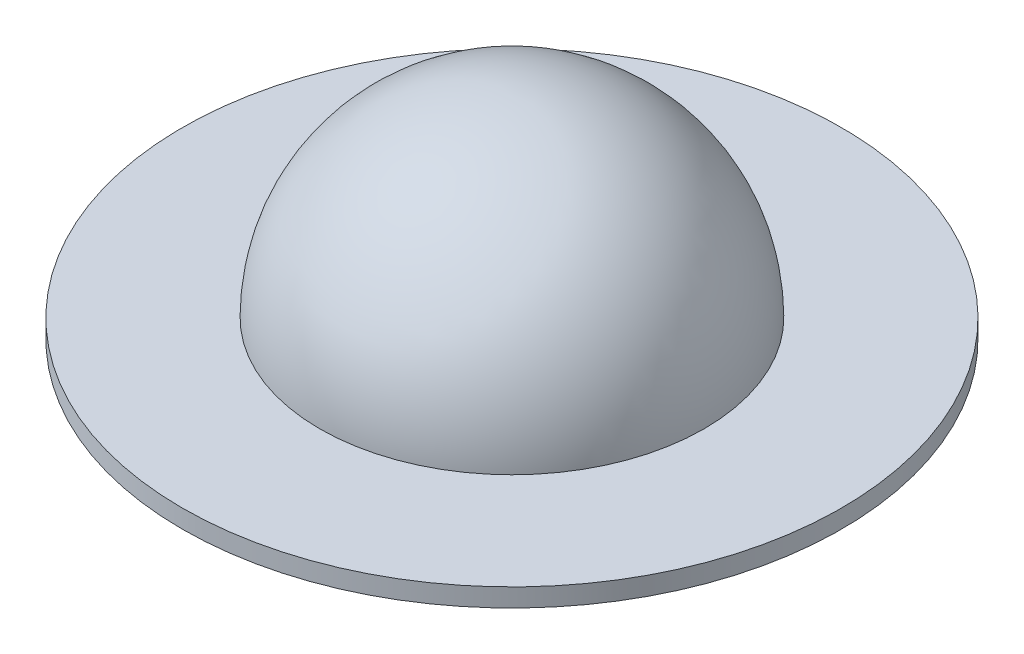
ISO-10303-21;
HEADER;
FILE_DESCRIPTION(('STEP AP214'),'2;1');
FILE_NAME('part.step','',(''),(''),'','','');
FILE_SCHEMA(('AUTOMOTIVE_DESIGN { 1 0 10303 214 1 1 1 1 }'));
ENDSEC;
DATA;
#1=APPLICATION_CONTEXT('core data for automotive mechanical design processes');
#2=APPLICATION_PROTOCOL_DEFINITION('international standard','automotive_design',2000,#1);
#3=PRODUCT_CONTEXT('',#1,'mechanical');
#4=PRODUCT('Part','Part','',(#3));
#5=PRODUCT_RELATED_PRODUCT_CATEGORY('part','',(#4));
#6=PRODUCT_DEFINITION_FORMATION('','',#4);
#7=PRODUCT_DEFINITION_CONTEXT('part definition',#1,'design');
#8=PRODUCT_DEFINITION('design','',#6,#7);
#9=PRODUCT_DEFINITION_SHAPE('','',#8);
#10=(LENGTH_UNIT() NAMED_UNIT(*) SI_UNIT(.MILLI.,.METRE.));
#11=(NAMED_UNIT(*) PLANE_ANGLE_UNIT() SI_UNIT($,.RADIAN.));
#12=(NAMED_UNIT(*) SI_UNIT($,.STERADIAN.) SOLID_ANGLE_UNIT());
#13=UNCERTAINTY_MEASURE_WITH_UNIT(LENGTH_MEASURE(1.E-05),#10,'distance_accuracy_value','');
#14=(GEOMETRIC_REPRESENTATION_CONTEXT(3) GLOBAL_UNCERTAINTY_ASSIGNED_CONTEXT((#13)) GLOBAL_UNIT_ASSIGNED_CONTEXT((#10,
#11,#12)) REPRESENTATION_CONTEXT('',''));
#15=CARTESIAN_POINT('',(0.,0.,0.));
#16=DIRECTION('',(0.,0.,1.));
#17=DIRECTION('',(1.,0.,0.));
#18=AXIS2_PLACEMENT_3D('',#15,#16,#17);
#19=CARTESIAN_POINT('',(0.,4.,0.));
#20=DIRECTION('',(0.,-1.,0.));
#21=DIRECTION('',(0.,0.,-1.));
#22=AXIS2_PLACEMENT_3D('',#19,#20,#21);
#23=CYLINDRICAL_SURFACE('',#22,72.);
#24=CARTESIAN_POINT('',(0.,4.,0.));
#25=DIRECTION('',(0.,1.,0.));
#26=DIRECTION('',(0.,0.,1.));
#27=AXIS2_PLACEMENT_3D('',#24,#25,#26);
#28=CIRCLE('',#27,72.);
#29=CARTESIAN_POINT('',(0.,4.,72.));
#30=VERTEX_POINT('',#29);
#31=EDGE_CURVE('E37',#30,#30,#28,.T.);
#32=ORIENTED_EDGE('',*,*,#31,.F.);
#33=EDGE_LOOP('',(#32));
#34=FACE_BOUND('',#33,.T.);
#35=CARTESIAN_POINT('',(0.,0.,0.));
#36=DIRECTION('',(0.,1.,0.));
#37=DIRECTION('',(0.,0.,1.));
#38=AXIS2_PLACEMENT_3D('',#35,#36,#37);
#39=CIRCLE('',#38,72.);
#40=CARTESIAN_POINT('',(0.,0.,72.));
#41=VERTEX_POINT('',#40);
#42=EDGE_CURVE('E41',#41,#41,#39,.T.);
#43=ORIENTED_EDGE('',*,*,#42,.T.);
#44=EDGE_LOOP('',(#43));
#45=FACE_BOUND('',#44,.T.);
#46=ADVANCED_FACE('F31',(#34,#45),#23,.T.);
#47=CARTESIAN_POINT('',(0.,4.,0.));
#48=DIRECTION('',(0.,1.,0.));
#49=DIRECTION('',(0.,0.,1.));
#50=AXIS2_PLACEMENT_3D('',#47,#48,#49);
#51=PLANE('',#50);
#52=CARTESIAN_POINT('',(0.,4.,0.));
#53=DIRECTION('',(0.,1.,0.));
#54=DIRECTION('',(0.,0.,1.));
#55=AXIS2_PLACEMENT_3D('',#52,#53,#54);
#56=CIRCLE('',#55,42.);
#57=CARTESIAN_POINT('',(0.,4.,42.));
#58=VERTEX_POINT('',#57);
#59=EDGE_CURVE('E10',#58,#58,#56,.T.);
#60=ORIENTED_EDGE('',*,*,#59,.F.);
#61=EDGE_LOOP('',(#60));
#62=FACE_BOUND('',#61,.T.);
#63=ORIENTED_EDGE('',*,*,#31,.T.);
#64=EDGE_LOOP('',(#63));
#65=FACE_BOUND('',#64,.T.);
#66=ADVANCED_FACE('F52',(#62,#65),#51,.T.);
#67=CARTESIAN_POINT('',(0.,0.,0.));
#68=DIRECTION('',(0.,1.,0.));
#69=DIRECTION('',(0.,0.,1.));
#70=AXIS2_PLACEMENT_3D('',#67,#68,#69);
#71=PLANE('',#70);
#72=ORIENTED_EDGE('',*,*,#42,.F.);
#73=EDGE_LOOP('',(#72));
#74=FACE_BOUND('',#73,.T.);
#75=ADVANCED_FACE('F49',(#74),#71,.F.);
#76=CARTESIAN_POINT('',(0.,4.,0.));
#77=DIRECTION('',(0.,-1.,0.));
#78=DIRECTION('',(1.,0.,0.));
#79=AXIS2_PLACEMENT_3D('',#76,#77,#78);
#80=SPHERICAL_SURFACE('',#79,42.);
#81=ORIENTED_EDGE('',*,*,#59,.T.);
#82=EDGE_LOOP('',(#81));
#83=FACE_BOUND('',#82,.T.);
#84=ADVANCED_FACE('F51',(#83),#80,.T.);
#85=CLOSED_SHELL('',(#46,#66,#75,#84));
#86=MANIFOLD_SOLID_BREP('B2',#85);
#87=ADVANCED_BREP_SHAPE_REPRESENTATION('',(#18,#86),#14);
#88=SHAPE_DEFINITION_REPRESENTATION(#9,#87);
ENDSEC;
END-ISO-10303-21;
